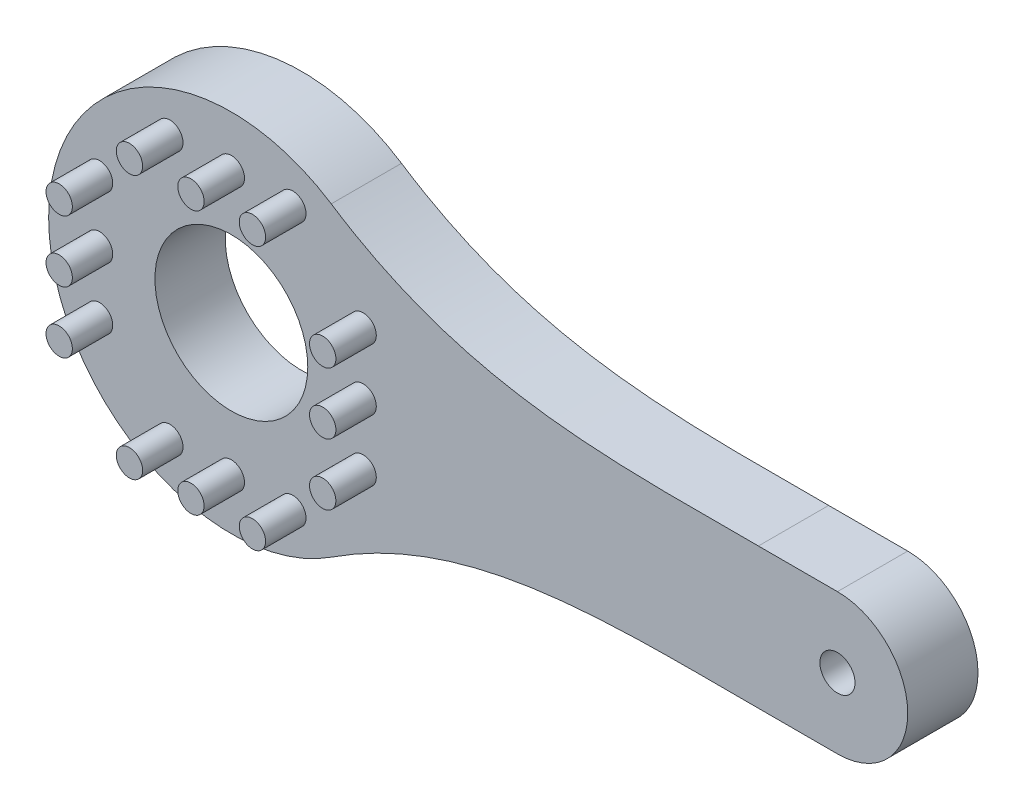
ISO-10303-21;
HEADER;
FILE_DESCRIPTION(('STEP AP214'),'2;1');
FILE_NAME('part.step','',(''),(''),'','','');
FILE_SCHEMA(('AUTOMOTIVE_DESIGN { 1 0 10303 214 1 1 1 1 }'));
ENDSEC;
DATA;
#1=APPLICATION_CONTEXT('core data for automotive mechanical design processes');
#2=APPLICATION_PROTOCOL_DEFINITION('international standard','automotive_design',2000,#1);
#3=PRODUCT_CONTEXT('',#1,'mechanical');
#4=PRODUCT('Part','Part','',(#3));
#5=PRODUCT_RELATED_PRODUCT_CATEGORY('part','',(#4));
#6=PRODUCT_DEFINITION_FORMATION('','',#4);
#7=PRODUCT_DEFINITION_CONTEXT('part definition',#1,'design');
#8=PRODUCT_DEFINITION('design','',#6,#7);
#9=PRODUCT_DEFINITION_SHAPE('','',#8);
#10=(LENGTH_UNIT() NAMED_UNIT(*) SI_UNIT(.MILLI.,.METRE.));
#11=(NAMED_UNIT(*) PLANE_ANGLE_UNIT() SI_UNIT($,.RADIAN.));
#12=(NAMED_UNIT(*) SI_UNIT($,.STERADIAN.) SOLID_ANGLE_UNIT());
#13=UNCERTAINTY_MEASURE_WITH_UNIT(LENGTH_MEASURE(1.E-05),#10,'distance_accuracy_value','');
#14=(GEOMETRIC_REPRESENTATION_CONTEXT(3) GLOBAL_UNCERTAINTY_ASSIGNED_CONTEXT((#13)) GLOBAL_UNIT_ASSIGNED_CONTEXT((#10,
#11,#12)) REPRESENTATION_CONTEXT('',''));
#15=CARTESIAN_POINT('',(0.,0.,0.));
#16=DIRECTION('',(0.,0.,1.));
#17=DIRECTION('',(1.,0.,0.));
#18=AXIS2_PLACEMENT_3D('',#15,#16,#17);
#19=CARTESIAN_POINT('',(17.4647591380404,4.46248690203293,4.));
#20=DIRECTION('',(0.,0.,-1.));
#21=DIRECTION('',(-1.,0.,0.));
#22=AXIS2_PLACEMENT_3D('',#19,#20,#21);
#23=PLANE('',#22);
#24=CARTESIAN_POINT('',(-7.5,3.5,4.));
#25=DIRECTION('',(0.,0.,-1.));
#26=DIRECTION('',(-1.,0.,0.));
#27=AXIS2_PLACEMENT_3D('',#24,#25,#26);
#28=CIRCLE('',#27,0.75);
#29=CARTESIAN_POINT('',(-8.25,3.5,4.));
#30=VERTEX_POINT('',#29);
#31=EDGE_CURVE('E11',#30,#30,#28,.F.);
#32=ORIENTED_EDGE('',*,*,#31,.F.);
#33=EDGE_LOOP('',(#32));
#34=FACE_BOUND('',#33,.T.);
#35=CARTESIAN_POINT('',(-7.5,0.,4.));
#36=DIRECTION('',(0.,0.,-1.));
#37=DIRECTION('',(-1.,0.,0.));
#38=AXIS2_PLACEMENT_3D('',#35,#36,#37);
#39=CIRCLE('',#38,0.749999999999998);
#40=CARTESIAN_POINT('',(-8.25,0.,4.));
#41=VERTEX_POINT('',#40);
#42=EDGE_CURVE('E48',#41,#41,#39,.F.);
#43=ORIENTED_EDGE('',*,*,#42,.F.);
#44=EDGE_LOOP('',(#43));
#45=FACE_BOUND('',#44,.T.);
#46=CARTESIAN_POINT('',(-7.5,-3.5,4.));
#47=DIRECTION('',(0.,0.,-1.));
#48=DIRECTION('',(-1.,0.,0.));
#49=AXIS2_PLACEMENT_3D('',#46,#47,#48);
#50=CIRCLE('',#49,0.75);
#51=CARTESIAN_POINT('',(-8.25,-3.5,4.));
#52=VERTEX_POINT('',#51);
#53=EDGE_CURVE('E182',#52,#52,#50,.F.);
#54=ORIENTED_EDGE('',*,*,#53,.F.);
#55=EDGE_LOOP('',(#54));
#56=FACE_BOUND('',#55,.T.);
#57=CARTESIAN_POINT('',(7.5,-3.5,4.));
#58=DIRECTION('',(0.,0.,-1.));
#59=DIRECTION('',(-1.,0.,0.));
#60=AXIS2_PLACEMENT_3D('',#57,#58,#59);
#61=CIRCLE('',#60,0.75);
#62=CARTESIAN_POINT('',(6.75,-3.5,4.));
#63=VERTEX_POINT('',#62);
#64=EDGE_CURVE('E179',#63,#63,#61,.F.);
#65=ORIENTED_EDGE('',*,*,#64,.F.);
#66=EDGE_LOOP('',(#65));
#67=FACE_BOUND('',#66,.T.);
#68=CARTESIAN_POINT('',(7.5,0.,4.));
#69=DIRECTION('',(0.,0.,-1.));
#70=DIRECTION('',(-1.,0.,0.));
#71=AXIS2_PLACEMENT_3D('',#68,#69,#70);
#72=CIRCLE('',#71,0.749999999999998);
#73=CARTESIAN_POINT('',(6.75,0.,4.));
#74=VERTEX_POINT('',#73);
#75=EDGE_CURVE('E176',#74,#74,#72,.F.);
#76=ORIENTED_EDGE('',*,*,#75,.F.);
#77=EDGE_LOOP('',(#76));
#78=FACE_BOUND('',#77,.T.);
#79=CARTESIAN_POINT('',(-3.5,-7.5,4.));
#80=DIRECTION('',(0.,0.,-1.));
#81=DIRECTION('',(-1.,0.,0.));
#82=AXIS2_PLACEMENT_3D('',#79,#80,#81);
#83=CIRCLE('',#82,0.749999999999999);
#84=CARTESIAN_POINT('',(-4.25,-7.5,4.));
#85=VERTEX_POINT('',#84);
#86=EDGE_CURVE('E173',#85,#85,#83,.F.);
#87=ORIENTED_EDGE('',*,*,#86,.F.);
#88=EDGE_LOOP('',(#87));
#89=FACE_BOUND('',#88,.T.);
#90=CARTESIAN_POINT('',(0.,-7.5,4.));
#91=DIRECTION('',(0.,0.,-1.));
#92=DIRECTION('',(-1.,0.,0.));
#93=AXIS2_PLACEMENT_3D('',#90,#91,#92);
#94=CIRCLE('',#93,0.75);
#95=CARTESIAN_POINT('',(-0.750000000000001,-7.5,4.));
#96=VERTEX_POINT('',#95);
#97=EDGE_CURVE('E170',#96,#96,#94,.F.);
#98=ORIENTED_EDGE('',*,*,#97,.F.);
#99=EDGE_LOOP('',(#98));
#100=FACE_BOUND('',#99,.T.);
#101=CARTESIAN_POINT('',(3.5,-7.5,4.));
#102=DIRECTION('',(0.,0.,-1.));
#103=DIRECTION('',(-1.,0.,0.));
#104=AXIS2_PLACEMENT_3D('',#101,#102,#103);
#105=CIRCLE('',#104,0.749999999999999);
#106=CARTESIAN_POINT('',(2.75,-7.5,4.));
#107=VERTEX_POINT('',#106);
#108=EDGE_CURVE('E167',#107,#107,#105,.F.);
#109=ORIENTED_EDGE('',*,*,#108,.F.);
#110=EDGE_LOOP('',(#109));
#111=FACE_BOUND('',#110,.T.);
#112=CARTESIAN_POINT('',(-3.5,7.5,4.));
#113=DIRECTION('',(0.,0.,-1.));
#114=DIRECTION('',(-1.,0.,0.));
#115=AXIS2_PLACEMENT_3D('',#112,#113,#114);
#116=CIRCLE('',#115,0.749999999999999);
#117=CARTESIAN_POINT('',(-4.25,7.5,4.));
#118=VERTEX_POINT('',#117);
#119=EDGE_CURVE('E164',#118,#118,#116,.F.);
#120=ORIENTED_EDGE('',*,*,#119,.F.);
#121=EDGE_LOOP('',(#120));
#122=FACE_BOUND('',#121,.T.);
#123=CARTESIAN_POINT('',(7.5,3.5,4.));
#124=DIRECTION('',(0.,0.,-1.));
#125=DIRECTION('',(-1.,0.,0.));
#126=AXIS2_PLACEMENT_3D('',#123,#124,#125);
#127=CIRCLE('',#126,0.75);
#128=CARTESIAN_POINT('',(6.75,3.5,4.));
#129=VERTEX_POINT('',#128);
#130=EDGE_CURVE('E161',#129,#129,#127,.F.);
#131=ORIENTED_EDGE('',*,*,#130,.F.);
#132=EDGE_LOOP('',(#131));
#133=FACE_BOUND('',#132,.T.);
#134=CARTESIAN_POINT('',(3.5,7.5,4.));
#135=DIRECTION('',(0.,0.,-1.));
#136=DIRECTION('',(-1.,0.,0.));
#137=AXIS2_PLACEMENT_3D('',#134,#135,#136);
#138=CIRCLE('',#137,0.749999999999999);
#139=CARTESIAN_POINT('',(2.75,7.5,4.));
#140=VERTEX_POINT('',#139);
#141=EDGE_CURVE('E158',#140,#140,#138,.F.);
#142=ORIENTED_EDGE('',*,*,#141,.F.);
#143=EDGE_LOOP('',(#142));
#144=FACE_BOUND('',#143,.T.);
#145=CARTESIAN_POINT('',(0.,7.5,4.));
#146=DIRECTION('',(0.,0.,-1.));
#147=DIRECTION('',(-1.,0.,0.));
#148=AXIS2_PLACEMENT_3D('',#145,#146,#147);
#149=CIRCLE('',#148,0.75);
#150=CARTESIAN_POINT('',(-0.750000000000001,7.5,4.));
#151=VERTEX_POINT('',#150);
#152=EDGE_CURVE('E155',#151,#151,#149,.F.);
#153=ORIENTED_EDGE('',*,*,#152,.F.);
#154=EDGE_LOOP('',(#153));
#155=FACE_BOUND('',#154,.T.);
#156=CARTESIAN_POINT('',(30.,4.,4.));
#157=CARTESIAN_POINT('',(21.2668653818899,4.,4.));
#158=CARTESIAN_POINT('',(13.4104279790372,3.66400440550072,4.));
#159=CARTESIAN_POINT('',(5.68619302154209,8.70788199976125,4.));
#160=B_SPLINE_CURVE_WITH_KNOTS('',3,(#156,#157,#158,#159),.UNSPECIFIED.,.F.,.F.,(4,4),(0.,1.),.UNSPECIFIED.);
#161=CARTESIAN_POINT('',(30.,4.,4.));
#162=VERTEX_POINT('',#161);
#163=CARTESIAN_POINT('',(5.68619302154209,8.70788199976125,4.));
#164=VERTEX_POINT('',#163);
#165=EDGE_CURVE('E146',#162,#164,#160,.T.);
#166=ORIENTED_EDGE('',*,*,#165,.T.);
#167=CARTESIAN_POINT('',(0.,0.,4.));
#168=DIRECTION('',(0.,0.,1.));
#169=DIRECTION('',(1.,0.,0.));
#170=AXIS2_PLACEMENT_3D('',#167,#168,#169);
#171=CIRCLE('',#170,10.4);
#172=CARTESIAN_POINT('',(5.68619302154209,-8.70788199976125,4.));
#173=VERTEX_POINT('',#172);
#174=EDGE_CURVE('E94',#164,#173,#171,.T.);
#175=ORIENTED_EDGE('',*,*,#174,.T.);
#176=CARTESIAN_POINT('',(5.68619302154209,-8.70788199976125,4.));
#177=CARTESIAN_POINT('',(13.4104279790372,-3.66400440550072,4.));
#178=CARTESIAN_POINT('',(21.2668653818899,-4.,4.));
#179=CARTESIAN_POINT('',(30.,-4.,4.));
#180=B_SPLINE_CURVE_WITH_KNOTS('',3,(#176,#177,#178,#179),.UNSPECIFIED.,.F.,.F.,(4,4),(0.,1.),.UNSPECIFIED.);
#181=CARTESIAN_POINT('',(30.,-4.,4.));
#182=VERTEX_POINT('',#181);
#183=EDGE_CURVE('E107',#173,#182,#180,.T.);
#184=ORIENTED_EDGE('',*,*,#183,.T.);
#185=DIRECTION('',(1.,0.,0.));
#186=VECTOR('',#185,1.);
#187=CARTESIAN_POINT('',(30.,-4.,4.));
#188=LINE('',#187,#186);
#189=CARTESIAN_POINT('',(34.5,-4.,4.));
#190=VERTEX_POINT('',#189);
#191=EDGE_CURVE('E101',#182,#190,#188,.T.);
#192=ORIENTED_EDGE('',*,*,#191,.T.);
#193=CARTESIAN_POINT('',(34.5,0.,4.));
#194=DIRECTION('',(0.,0.,1.));
#195=DIRECTION('',(-1.,0.,0.));
#196=AXIS2_PLACEMENT_3D('',#193,#194,#195);
#197=CIRCLE('',#196,4.);
#198=CARTESIAN_POINT('',(34.5,4.,4.));
#199=VERTEX_POINT('',#198);
#200=EDGE_CURVE('E105',#190,#199,#197,.T.);
#201=ORIENTED_EDGE('',*,*,#200,.T.);
#202=DIRECTION('',(-1.,0.,0.));
#203=VECTOR('',#202,1.);
#204=CARTESIAN_POINT('',(30.,4.,4.));
#205=LINE('',#204,#203);
#206=EDGE_CURVE('E56',#199,#162,#205,.T.);
#207=ORIENTED_EDGE('',*,*,#206,.T.);
#208=EDGE_LOOP('',(#166,#175,#184,#192,#201,#207));
#209=FACE_BOUND('',#208,.T.);
#210=CARTESIAN_POINT('',(34.5,0.,4.));
#211=DIRECTION('',(0.,0.,1.));
#212=DIRECTION('',(1.,0.,0.));
#213=AXIS2_PLACEMENT_3D('',#210,#211,#212);
#214=CIRCLE('',#213,0.999999999999998);
#215=CARTESIAN_POINT('',(35.5,0.,4.));
#216=VERTEX_POINT('',#215);
#217=EDGE_CURVE('E131',#216,#216,#214,.T.);
#218=ORIENTED_EDGE('',*,*,#217,.F.);
#219=EDGE_LOOP('',(#218));
#220=FACE_BOUND('',#219,.T.);
#221=CARTESIAN_POINT('',(0.,0.,4.));
#222=DIRECTION('',(0.,0.,1.));
#223=DIRECTION('',(1.,0.,0.));
#224=AXIS2_PLACEMENT_3D('',#221,#222,#223);
#225=CIRCLE('',#224,4.35);
#226=CARTESIAN_POINT('',(4.35,0.,4.));
#227=VERTEX_POINT('',#226);
#228=EDGE_CURVE('E267',#227,#227,#225,.T.);
#229=ORIENTED_EDGE('',*,*,#228,.F.);
#230=EDGE_LOOP('',(#229));
#231=FACE_BOUND('',#230,.T.);
#232=ADVANCED_FACE('F38',(#34,#45,#56,#67,#78,#89,#100,#111,#122,#133,#144,#155,#209,#220,#231),
#23,.F.);
#233=CARTESIAN_POINT('',(17.4647591380404,4.46248690203293,0.));
#234=DIRECTION('',(0.,0.,-1.));
#235=DIRECTION('',(-1.,0.,0.));
#236=AXIS2_PLACEMENT_3D('',#233,#234,#235);
#237=PLANE('',#236);
#238=CARTESIAN_POINT('',(34.5,0.,0.));
#239=DIRECTION('',(0.,0.,1.));
#240=DIRECTION('',(1.,0.,0.));
#241=AXIS2_PLACEMENT_3D('',#238,#239,#240);
#242=CIRCLE('',#241,0.999999999999998);
#243=CARTESIAN_POINT('',(35.5,0.,0.));
#244=VERTEX_POINT('',#243);
#245=EDGE_CURVE('E261',#244,#244,#242,.T.);
#246=ORIENTED_EDGE('',*,*,#245,.T.);
#247=EDGE_LOOP('',(#246));
#248=FACE_BOUND('',#247,.T.);
#249=CARTESIAN_POINT('',(30.,4.,0.));
#250=CARTESIAN_POINT('',(21.2668653818899,4.,0.));
#251=CARTESIAN_POINT('',(13.4104279790372,3.66400440550072,0.));
#252=CARTESIAN_POINT('',(5.68619302154209,8.70788199976125,0.));
#253=B_SPLINE_CURVE_WITH_KNOTS('',3,(#249,#250,#251,#252),.UNSPECIFIED.,.F.,.F.,(4,4),(0.,1.),.UNSPECIFIED.);
#254=CARTESIAN_POINT('',(30.,4.,0.));
#255=VERTEX_POINT('',#254);
#256=CARTESIAN_POINT('',(5.68619302154209,8.70788199976125,0.));
#257=VERTEX_POINT('',#256);
#258=EDGE_CURVE('E125',#255,#257,#253,.T.);
#259=ORIENTED_EDGE('',*,*,#258,.F.);
#260=DIRECTION('',(-1.,0.,0.));
#261=VECTOR('',#260,1.);
#262=CARTESIAN_POINT('',(30.,4.,0.));
#263=LINE('',#262,#261);
#264=CARTESIAN_POINT('',(34.5,4.,0.));
#265=VERTEX_POINT('',#264);
#266=EDGE_CURVE('E85',#265,#255,#263,.T.);
#267=ORIENTED_EDGE('',*,*,#266,.F.);
#268=CARTESIAN_POINT('',(34.5,0.,0.));
#269=DIRECTION('',(0.,0.,1.));
#270=DIRECTION('',(-1.,0.,0.));
#271=AXIS2_PLACEMENT_3D('',#268,#269,#270);
#272=CIRCLE('',#271,4.);
#273=CARTESIAN_POINT('',(34.5,-4.,0.));
#274=VERTEX_POINT('',#273);
#275=EDGE_CURVE('E79',#274,#265,#272,.T.);
#276=ORIENTED_EDGE('',*,*,#275,.F.);
#277=DIRECTION('',(1.,0.,0.));
#278=VECTOR('',#277,1.);
#279=CARTESIAN_POINT('',(30.,-4.,0.));
#280=LINE('',#279,#278);
#281=CARTESIAN_POINT('',(30.,-4.,0.));
#282=VERTEX_POINT('',#281);
#283=EDGE_CURVE('E115',#282,#274,#280,.T.);
#284=ORIENTED_EDGE('',*,*,#283,.F.);
#285=CARTESIAN_POINT('',(5.68619302154209,-8.70788199976125,0.));
#286=CARTESIAN_POINT('',(13.4104279790372,-3.66400440550072,0.));
#287=CARTESIAN_POINT('',(21.2668653818899,-4.,0.));
#288=CARTESIAN_POINT('',(30.,-4.,0.));
#289=B_SPLINE_CURVE_WITH_KNOTS('',3,(#285,#286,#287,#288),.UNSPECIFIED.,.F.,.F.,(4,4),(0.,1.),.UNSPECIFIED.);
#290=CARTESIAN_POINT('',(5.68619302154209,-8.70788199976125,0.));
#291=VERTEX_POINT('',#290);
#292=EDGE_CURVE('E136',#291,#282,#289,.T.);
#293=ORIENTED_EDGE('',*,*,#292,.F.);
#294=CARTESIAN_POINT('',(0.,0.,0.));
#295=DIRECTION('',(0.,0.,1.));
#296=DIRECTION('',(1.,0.,0.));
#297=AXIS2_PLACEMENT_3D('',#294,#295,#296);
#298=CIRCLE('',#297,10.4);
#299=EDGE_CURVE('E130',#257,#291,#298,.T.);
#300=ORIENTED_EDGE('',*,*,#299,.F.);
#301=EDGE_LOOP('',(#259,#267,#276,#284,#293,#300));
#302=FACE_BOUND('',#301,.T.);
#303=CARTESIAN_POINT('',(0.,0.,0.));
#304=DIRECTION('',(0.,0.,1.));
#305=DIRECTION('',(1.,0.,0.));
#306=AXIS2_PLACEMENT_3D('',#303,#304,#305);
#307=CIRCLE('',#306,4.35);
#308=CARTESIAN_POINT('',(4.35,0.,0.));
#309=VERTEX_POINT('',#308);
#310=EDGE_CURVE('E270',#309,#309,#307,.T.);
#311=ORIENTED_EDGE('',*,*,#310,.T.);
#312=EDGE_LOOP('',(#311));
#313=FACE_BOUND('',#312,.T.);
#314=ADVANCED_FACE('F191',(#248,#302,#313),#237,.T.);
#315=DIRECTION('',(0.,0.,-1.));
#316=VECTOR('',#315,1.);
#317=SURFACE_OF_LINEAR_EXTRUSION('',#160,#316);
#318=ORIENTED_EDGE('',*,*,#258,.T.);
#319=DIRECTION('',(0.,0.,-1.));
#320=VECTOR('',#319,1.);
#321=CARTESIAN_POINT('',(5.68619302154209,8.70788199976125,4.));
#322=LINE('',#321,#320);
#323=EDGE_CURVE('E153',#164,#257,#322,.T.);
#324=ORIENTED_EDGE('',*,*,#323,.F.);
#325=ORIENTED_EDGE('',*,*,#165,.F.);
#326=DIRECTION('',(0.,0.,-1.));
#327=VECTOR('',#326,1.);
#328=CARTESIAN_POINT('',(30.,4.,4.));
#329=LINE('',#328,#327);
#330=EDGE_CURVE('E121',#162,#255,#329,.T.);
#331=ORIENTED_EDGE('',*,*,#330,.T.);
#332=EDGE_LOOP('',(#318,#324,#325,#331));
#333=FACE_BOUND('',#332,.T.);
#334=ADVANCED_FACE('F40',(#333),#317,.F.);
#335=CARTESIAN_POINT('',(0.,0.,4.));
#336=DIRECTION('',(0.,0.,-1.));
#337=DIRECTION('',(-1.,0.,0.));
#338=AXIS2_PLACEMENT_3D('',#335,#336,#337);
#339=CYLINDRICAL_SURFACE('',#338,10.4);
#340=ORIENTED_EDGE('',*,*,#299,.T.);
#341=DIRECTION('',(0.,0.,-1.));
#342=VECTOR('',#341,1.);
#343=CARTESIAN_POINT('',(5.68619302154209,-8.70788199976125,4.));
#344=LINE('',#343,#342);
#345=EDGE_CURVE('E150',#173,#291,#344,.T.);
#346=ORIENTED_EDGE('',*,*,#345,.F.);
#347=ORIENTED_EDGE('',*,*,#174,.F.);
#348=ORIENTED_EDGE('',*,*,#323,.T.);
#349=EDGE_LOOP('',(#340,#346,#347,#348));
#350=FACE_BOUND('',#349,.T.);
#351=ADVANCED_FACE('F248',(#350),#339,.T.);
#352=DIRECTION('',(0.,0.,-1.));
#353=VECTOR('',#352,1.);
#354=SURFACE_OF_LINEAR_EXTRUSION('',#180,#353);
#355=ORIENTED_EDGE('',*,*,#292,.T.);
#356=DIRECTION('',(0.,0.,-1.));
#357=VECTOR('',#356,1.);
#358=CARTESIAN_POINT('',(30.,-4.,4.));
#359=LINE('',#358,#357);
#360=EDGE_CURVE('E116',#182,#282,#359,.T.);
#361=ORIENTED_EDGE('',*,*,#360,.F.);
#362=ORIENTED_EDGE('',*,*,#183,.F.);
#363=ORIENTED_EDGE('',*,*,#345,.T.);
#364=EDGE_LOOP('',(#355,#361,#362,#363));
#365=FACE_BOUND('',#364,.T.);
#366=ADVANCED_FACE('F246',(#365),#354,.F.);
#367=CARTESIAN_POINT('',(30.,-4.,4.));
#368=DIRECTION('',(0.,1.,0.));
#369=DIRECTION('',(0.,0.,1.));
#370=AXIS2_PLACEMENT_3D('',#367,#368,#369);
#371=PLANE('',#370);
#372=ORIENTED_EDGE('',*,*,#283,.T.);
#373=DIRECTION('',(0.,0.,-1.));
#374=VECTOR('',#373,1.);
#375=CARTESIAN_POINT('',(34.5,-4.,4.));
#376=LINE('',#375,#374);
#377=EDGE_CURVE('E112',#190,#274,#376,.T.);
#378=ORIENTED_EDGE('',*,*,#377,.F.);
#379=ORIENTED_EDGE('',*,*,#191,.F.);
#380=ORIENTED_EDGE('',*,*,#360,.T.);
#381=EDGE_LOOP('',(#372,#378,#379,#380));
#382=FACE_BOUND('',#381,.T.);
#383=ADVANCED_FACE('F113',(#382),#371,.F.);
#384=CARTESIAN_POINT('',(34.5,0.,4.));
#385=DIRECTION('',(0.,0.,-1.));
#386=DIRECTION('',(-1.,0.,0.));
#387=AXIS2_PLACEMENT_3D('',#384,#385,#386);
#388=CYLINDRICAL_SURFACE('',#387,4.);
#389=ORIENTED_EDGE('',*,*,#275,.T.);
#390=DIRECTION('',(0.,0.,-1.));
#391=VECTOR('',#390,1.);
#392=CARTESIAN_POINT('',(34.5,4.,4.));
#393=LINE('',#392,#391);
#394=EDGE_CURVE('E117',#199,#265,#393,.T.);
#395=ORIENTED_EDGE('',*,*,#394,.F.);
#396=ORIENTED_EDGE('',*,*,#200,.F.);
#397=ORIENTED_EDGE('',*,*,#377,.T.);
#398=EDGE_LOOP('',(#389,#395,#396,#397));
#399=FACE_BOUND('',#398,.T.);
#400=ADVANCED_FACE('F119',(#399),#388,.T.);
#401=CARTESIAN_POINT('',(30.,4.,4.));
#402=DIRECTION('',(0.,-1.,0.));
#403=DIRECTION('',(0.,0.,-1.));
#404=AXIS2_PLACEMENT_3D('',#401,#402,#403);
#405=PLANE('',#404);
#406=ORIENTED_EDGE('',*,*,#266,.T.);
#407=ORIENTED_EDGE('',*,*,#330,.F.);
#408=ORIENTED_EDGE('',*,*,#206,.F.);
#409=ORIENTED_EDGE('',*,*,#394,.T.);
#410=EDGE_LOOP('',(#406,#407,#408,#409));
#411=FACE_BOUND('',#410,.T.);
#412=ADVANCED_FACE('F234',(#411),#405,.F.);
#413=CARTESIAN_POINT('',(34.5,0.,4.));
#414=DIRECTION('',(0.,0.,-1.));
#415=DIRECTION('',(-1.,0.,0.));
#416=AXIS2_PLACEMENT_3D('',#413,#414,#415);
#417=CYLINDRICAL_SURFACE('',#416,0.999999999999998);
#418=ORIENTED_EDGE('',*,*,#217,.T.);
#419=EDGE_LOOP('',(#418));
#420=FACE_BOUND('',#419,.T.);
#421=ORIENTED_EDGE('',*,*,#245,.F.);
#422=EDGE_LOOP('',(#421));
#423=FACE_BOUND('',#422,.T.);
#424=ADVANCED_FACE('F227',(#420,#423),#417,.F.);
#425=CARTESIAN_POINT('',(0.,0.,4.));
#426=DIRECTION('',(0.,0.,-1.));
#427=DIRECTION('',(-1.,0.,0.));
#428=AXIS2_PLACEMENT_3D('',#425,#426,#427);
#429=CYLINDRICAL_SURFACE('',#428,4.35);
#430=ORIENTED_EDGE('',*,*,#228,.T.);
#431=EDGE_LOOP('',(#430));
#432=FACE_BOUND('',#431,.T.);
#433=ORIENTED_EDGE('',*,*,#310,.F.);
#434=EDGE_LOOP('',(#433));
#435=FACE_BOUND('',#434,.T.);
#436=ADVANCED_FACE('F217',(#432,#435),#429,.F.);
#437=CARTESIAN_POINT('',(0.,7.5,6.3));
#438=DIRECTION('',(0.,0.,-1.));
#439=DIRECTION('',(-1.,0.,0.));
#440=AXIS2_PLACEMENT_3D('',#437,#438,#439);
#441=CYLINDRICAL_SURFACE('',#440,0.75);
#442=CARTESIAN_POINT('',(0.,7.5,6.3));
#443=DIRECTION('',(0.,0.,1.));
#444=DIRECTION('',(1.,0.,0.));
#445=AXIS2_PLACEMENT_3D('',#442,#443,#444);
#446=CIRCLE('',#445,0.75);
#447=CARTESIAN_POINT('',(0.749999999999999,7.5,6.3));
#448=VERTEX_POINT('',#447);
#449=EDGE_CURVE('E273',#448,#448,#446,.T.);
#450=ORIENTED_EDGE('',*,*,#449,.F.);
#451=EDGE_LOOP('',(#450));
#452=FACE_BOUND('',#451,.T.);
#453=ORIENTED_EDGE('',*,*,#152,.T.);
#454=EDGE_LOOP('',(#453));
#455=FACE_BOUND('',#454,.T.);
#456=ADVANCED_FACE('F214',(#452,#455),#441,.T.);
#457=CARTESIAN_POINT('',(0.,7.5,6.3));
#458=DIRECTION('',(0.,0.,1.));
#459=DIRECTION('',(1.,0.,0.));
#460=AXIS2_PLACEMENT_3D('',#457,#458,#459);
#461=PLANE('',#460);
#462=ORIENTED_EDGE('',*,*,#449,.T.);
#463=EDGE_LOOP('',(#462));
#464=FACE_BOUND('',#463,.T.);
#465=ADVANCED_FACE('F216',(#464),#461,.T.);
#466=CARTESIAN_POINT('',(3.5,7.5,6.3));
#467=DIRECTION('',(0.,0.,-1.));
#468=DIRECTION('',(-1.,0.,0.));
#469=AXIS2_PLACEMENT_3D('',#466,#467,#468);
#470=CYLINDRICAL_SURFACE('',#469,0.749999999999999);
#471=CARTESIAN_POINT('',(3.5,7.5,6.3));
#472=DIRECTION('',(0.,0.,1.));
#473=DIRECTION('',(1.,0.,0.));
#474=AXIS2_PLACEMENT_3D('',#471,#472,#473);
#475=CIRCLE('',#474,0.749999999999999);
#476=CARTESIAN_POINT('',(4.25,7.5,6.3));
#477=VERTEX_POINT('',#476);
#478=EDGE_CURVE('E278',#477,#477,#475,.T.);
#479=ORIENTED_EDGE('',*,*,#478,.F.);
#480=EDGE_LOOP('',(#479));
#481=FACE_BOUND('',#480,.T.);
#482=ORIENTED_EDGE('',*,*,#141,.T.);
#483=EDGE_LOOP('',(#482));
#484=FACE_BOUND('',#483,.T.);
#485=ADVANCED_FACE('F224',(#481,#484),#470,.T.);
#486=CARTESIAN_POINT('',(3.5,7.5,6.3));
#487=DIRECTION('',(0.,0.,1.));
#488=DIRECTION('',(1.,0.,0.));
#489=AXIS2_PLACEMENT_3D('',#486,#487,#488);
#490=PLANE('',#489);
#491=ORIENTED_EDGE('',*,*,#478,.T.);
#492=EDGE_LOOP('',(#491));
#493=FACE_BOUND('',#492,.T.);
#494=ADVANCED_FACE('F394',(#493),#490,.T.);
#495=CARTESIAN_POINT('',(7.5,3.5,6.3));
#496=DIRECTION('',(0.,0.,-1.));
#497=DIRECTION('',(-1.,0.,0.));
#498=AXIS2_PLACEMENT_3D('',#495,#496,#497);
#499=CYLINDRICAL_SURFACE('',#498,0.75);
#500=CARTESIAN_POINT('',(7.5,3.5,6.3));
#501=DIRECTION('',(0.,0.,1.));
#502=DIRECTION('',(1.,0.,0.));
#503=AXIS2_PLACEMENT_3D('',#500,#501,#502);
#504=CIRCLE('',#503,0.75);
#505=CARTESIAN_POINT('',(8.25,3.5,6.3));
#506=VERTEX_POINT('',#505);
#507=EDGE_CURVE('E281',#506,#506,#504,.T.);
#508=ORIENTED_EDGE('',*,*,#507,.F.);
#509=EDGE_LOOP('',(#508));
#510=FACE_BOUND('',#509,.T.);
#511=ORIENTED_EDGE('',*,*,#130,.T.);
#512=EDGE_LOOP('',(#511));
#513=FACE_BOUND('',#512,.T.);
#514=ADVANCED_FACE('F390',(#510,#513),#499,.T.);
#515=CARTESIAN_POINT('',(7.5,3.5,6.3));
#516=DIRECTION('',(0.,0.,1.));
#517=DIRECTION('',(1.,0.,0.));
#518=AXIS2_PLACEMENT_3D('',#515,#516,#517);
#519=PLANE('',#518);
#520=ORIENTED_EDGE('',*,*,#507,.T.);
#521=EDGE_LOOP('',(#520));
#522=FACE_BOUND('',#521,.T.);
#523=ADVANCED_FACE('F386',(#522),#519,.T.);
#524=CARTESIAN_POINT('',(-3.5,7.5,6.3));
#525=DIRECTION('',(0.,0.,-1.));
#526=DIRECTION('',(-1.,0.,0.));
#527=AXIS2_PLACEMENT_3D('',#524,#525,#526);
#528=CYLINDRICAL_SURFACE('',#527,0.749999999999999);
#529=CARTESIAN_POINT('',(-3.5,7.5,6.3));
#530=DIRECTION('',(0.,0.,1.));
#531=DIRECTION('',(-1.,0.,0.));
#532=AXIS2_PLACEMENT_3D('',#529,#530,#531);
#533=CIRCLE('',#532,0.749999999999999);
#534=CARTESIAN_POINT('',(-4.25,7.5,6.3));
#535=VERTEX_POINT('',#534);
#536=EDGE_CURVE('E284',#535,#535,#533,.T.);
#537=ORIENTED_EDGE('',*,*,#536,.F.);
#538=EDGE_LOOP('',(#537));
#539=FACE_BOUND('',#538,.T.);
#540=ORIENTED_EDGE('',*,*,#119,.T.);
#541=EDGE_LOOP('',(#540));
#542=FACE_BOUND('',#541,.T.);
#543=ADVANCED_FACE('F382',(#539,#542),#528,.T.);
#544=CARTESIAN_POINT('',(-3.5,7.5,6.3));
#545=DIRECTION('',(0.,0.,-1.));
#546=DIRECTION('',(-1.,0.,0.));
#547=AXIS2_PLACEMENT_3D('',#544,#545,#546);
#548=PLANE('',#547);
#549=ORIENTED_EDGE('',*,*,#536,.T.);
#550=EDGE_LOOP('',(#549));
#551=FACE_BOUND('',#550,.T.);
#552=ADVANCED_FACE('F378',(#551),#548,.F.);
#553=CARTESIAN_POINT('',(3.5,-7.5,6.3));
#554=DIRECTION('',(0.,0.,-1.));
#555=DIRECTION('',(-1.,0.,0.));
#556=AXIS2_PLACEMENT_3D('',#553,#554,#555);
#557=CYLINDRICAL_SURFACE('',#556,0.749999999999999);
#558=CARTESIAN_POINT('',(3.5,-7.5,6.3));
#559=DIRECTION('',(0.,0.,1.));
#560=DIRECTION('',(-1.,0.,0.));
#561=AXIS2_PLACEMENT_3D('',#558,#559,#560);
#562=CIRCLE('',#561,0.749999999999999);
#563=CARTESIAN_POINT('',(2.75,-7.5,6.3));
#564=VERTEX_POINT('',#563);
#565=EDGE_CURVE('E287',#564,#564,#562,.T.);
#566=ORIENTED_EDGE('',*,*,#565,.F.);
#567=EDGE_LOOP('',(#566));
#568=FACE_BOUND('',#567,.T.);
#569=ORIENTED_EDGE('',*,*,#108,.T.);
#570=EDGE_LOOP('',(#569));
#571=FACE_BOUND('',#570,.T.);
#572=ADVANCED_FACE('F374',(#568,#571),#557,.T.);
#573=CARTESIAN_POINT('',(3.5,-7.5,6.3));
#574=DIRECTION('',(0.,0.,-1.));
#575=DIRECTION('',(-1.,0.,0.));
#576=AXIS2_PLACEMENT_3D('',#573,#574,#575);
#577=PLANE('',#576);
#578=ORIENTED_EDGE('',*,*,#565,.T.);
#579=EDGE_LOOP('',(#578));
#580=FACE_BOUND('',#579,.T.);
#581=ADVANCED_FACE('F370',(#580),#577,.F.);
#582=CARTESIAN_POINT('',(0.,-7.5,6.3));
#583=DIRECTION('',(0.,0.,-1.));
#584=DIRECTION('',(-1.,0.,0.));
#585=AXIS2_PLACEMENT_3D('',#582,#583,#584);
#586=CYLINDRICAL_SURFACE('',#585,0.75);
#587=CARTESIAN_POINT('',(0.,-7.5,6.3));
#588=DIRECTION('',(0.,0.,1.));
#589=DIRECTION('',(-1.,0.,0.));
#590=AXIS2_PLACEMENT_3D('',#587,#588,#589);
#591=CIRCLE('',#590,0.75);
#592=CARTESIAN_POINT('',(-0.750000000000001,-7.5,6.3));
#593=VERTEX_POINT('',#592);
#594=EDGE_CURVE('E290',#593,#593,#591,.T.);
#595=ORIENTED_EDGE('',*,*,#594,.F.);
#596=EDGE_LOOP('',(#595));
#597=FACE_BOUND('',#596,.T.);
#598=ORIENTED_EDGE('',*,*,#97,.T.);
#599=EDGE_LOOP('',(#598));
#600=FACE_BOUND('',#599,.T.);
#601=ADVANCED_FACE('F366',(#597,#600),#586,.T.);
#602=CARTESIAN_POINT('',(0.,-7.5,6.3));
#603=DIRECTION('',(0.,0.,-1.));
#604=DIRECTION('',(-1.,0.,0.));
#605=AXIS2_PLACEMENT_3D('',#602,#603,#604);
#606=PLANE('',#605);
#607=ORIENTED_EDGE('',*,*,#594,.T.);
#608=EDGE_LOOP('',(#607));
#609=FACE_BOUND('',#608,.T.);
#610=ADVANCED_FACE('F362',(#609),#606,.F.);
#611=CARTESIAN_POINT('',(-3.5,-7.5,6.3));
#612=DIRECTION('',(0.,0.,-1.));
#613=DIRECTION('',(-1.,0.,0.));
#614=AXIS2_PLACEMENT_3D('',#611,#612,#613);
#615=CYLINDRICAL_SURFACE('',#614,0.749999999999999);
#616=CARTESIAN_POINT('',(-3.5,-7.5,6.3));
#617=DIRECTION('',(0.,0.,1.));
#618=DIRECTION('',(1.,0.,0.));
#619=AXIS2_PLACEMENT_3D('',#616,#617,#618);
#620=CIRCLE('',#619,0.749999999999999);
#621=CARTESIAN_POINT('',(-2.75,-7.5,6.3));
#622=VERTEX_POINT('',#621);
#623=EDGE_CURVE('E293',#622,#622,#620,.T.);
#624=ORIENTED_EDGE('',*,*,#623,.F.);
#625=EDGE_LOOP('',(#624));
#626=FACE_BOUND('',#625,.T.);
#627=ORIENTED_EDGE('',*,*,#86,.T.);
#628=EDGE_LOOP('',(#627));
#629=FACE_BOUND('',#628,.T.);
#630=ADVANCED_FACE('F358',(#626,#629),#615,.T.);
#631=CARTESIAN_POINT('',(-3.5,-7.5,6.3));
#632=DIRECTION('',(0.,0.,1.));
#633=DIRECTION('',(1.,0.,0.));
#634=AXIS2_PLACEMENT_3D('',#631,#632,#633);
#635=PLANE('',#634);
#636=ORIENTED_EDGE('',*,*,#623,.T.);
#637=EDGE_LOOP('',(#636));
#638=FACE_BOUND('',#637,.T.);
#639=ADVANCED_FACE('F354',(#638),#635,.T.);
#640=CARTESIAN_POINT('',(7.5,0.,6.3));
#641=DIRECTION('',(0.,0.,-1.));
#642=DIRECTION('',(-1.,0.,0.));
#643=AXIS2_PLACEMENT_3D('',#640,#641,#642);
#644=CYLINDRICAL_SURFACE('',#643,0.749999999999998);
#645=CARTESIAN_POINT('',(7.5,0.,6.3));
#646=DIRECTION('',(0.,0.,1.));
#647=DIRECTION('',(1.,0.,0.));
#648=AXIS2_PLACEMENT_3D('',#645,#646,#647);
#649=CIRCLE('',#648,0.749999999999998);
#650=CARTESIAN_POINT('',(8.25,0.,6.3));
#651=VERTEX_POINT('',#650);
#652=EDGE_CURVE('E296',#651,#651,#649,.T.);
#653=ORIENTED_EDGE('',*,*,#652,.F.);
#654=EDGE_LOOP('',(#653));
#655=FACE_BOUND('',#654,.T.);
#656=ORIENTED_EDGE('',*,*,#75,.T.);
#657=EDGE_LOOP('',(#656));
#658=FACE_BOUND('',#657,.T.);
#659=ADVANCED_FACE('F350',(#655,#658),#644,.T.);
#660=CARTESIAN_POINT('',(7.5,0.,6.3));
#661=DIRECTION('',(0.,0.,1.));
#662=DIRECTION('',(1.,0.,0.));
#663=AXIS2_PLACEMENT_3D('',#660,#661,#662);
#664=PLANE('',#663);
#665=ORIENTED_EDGE('',*,*,#652,.T.);
#666=EDGE_LOOP('',(#665));
#667=FACE_BOUND('',#666,.T.);
#668=ADVANCED_FACE('F346',(#667),#664,.T.);
#669=CARTESIAN_POINT('',(7.5,-3.5,6.3));
#670=DIRECTION('',(0.,0.,-1.));
#671=DIRECTION('',(-1.,0.,0.));
#672=AXIS2_PLACEMENT_3D('',#669,#670,#671);
#673=CYLINDRICAL_SURFACE('',#672,0.75);
#674=CARTESIAN_POINT('',(7.5,-3.5,6.3));
#675=DIRECTION('',(0.,0.,1.));
#676=DIRECTION('',(-1.,0.,0.));
#677=AXIS2_PLACEMENT_3D('',#674,#675,#676);
#678=CIRCLE('',#677,0.75);
#679=CARTESIAN_POINT('',(6.75,-3.5,6.3));
#680=VERTEX_POINT('',#679);
#681=EDGE_CURVE('E299',#680,#680,#678,.T.);
#682=ORIENTED_EDGE('',*,*,#681,.F.);
#683=EDGE_LOOP('',(#682));
#684=FACE_BOUND('',#683,.T.);
#685=ORIENTED_EDGE('',*,*,#64,.T.);
#686=EDGE_LOOP('',(#685));
#687=FACE_BOUND('',#686,.T.);
#688=ADVANCED_FACE('F342',(#684,#687),#673,.T.);
#689=CARTESIAN_POINT('',(7.5,-3.5,6.3));
#690=DIRECTION('',(0.,0.,-1.));
#691=DIRECTION('',(-1.,0.,0.));
#692=AXIS2_PLACEMENT_3D('',#689,#690,#691);
#693=PLANE('',#692);
#694=ORIENTED_EDGE('',*,*,#681,.T.);
#695=EDGE_LOOP('',(#694));
#696=FACE_BOUND('',#695,.T.);
#697=ADVANCED_FACE('F338',(#696),#693,.F.);
#698=CARTESIAN_POINT('',(-7.5,-3.5,6.3));
#699=DIRECTION('',(0.,0.,-1.));
#700=DIRECTION('',(-1.,0.,0.));
#701=AXIS2_PLACEMENT_3D('',#698,#699,#700);
#702=CYLINDRICAL_SURFACE('',#701,0.75);
#703=CARTESIAN_POINT('',(-7.5,-3.5,6.3));
#704=DIRECTION('',(0.,0.,1.));
#705=DIRECTION('',(1.,0.,0.));
#706=AXIS2_PLACEMENT_3D('',#703,#704,#705);
#707=CIRCLE('',#706,0.75);
#708=CARTESIAN_POINT('',(-6.75,-3.5,6.3));
#709=VERTEX_POINT('',#708);
#710=EDGE_CURVE('E302',#709,#709,#707,.T.);
#711=ORIENTED_EDGE('',*,*,#710,.F.);
#712=EDGE_LOOP('',(#711));
#713=FACE_BOUND('',#712,.T.);
#714=ORIENTED_EDGE('',*,*,#53,.T.);
#715=EDGE_LOOP('',(#714));
#716=FACE_BOUND('',#715,.T.);
#717=ADVANCED_FACE('F334',(#713,#716),#702,.T.);
#718=CARTESIAN_POINT('',(-7.5,-3.5,6.3));
#719=DIRECTION('',(0.,0.,1.));
#720=DIRECTION('',(1.,0.,0.));
#721=AXIS2_PLACEMENT_3D('',#718,#719,#720);
#722=PLANE('',#721);
#723=ORIENTED_EDGE('',*,*,#710,.T.);
#724=EDGE_LOOP('',(#723));
#725=FACE_BOUND('',#724,.T.);
#726=ADVANCED_FACE('F330',(#725),#722,.T.);
#727=CARTESIAN_POINT('',(-7.5,0.,6.3));
#728=DIRECTION('',(0.,0.,-1.));
#729=DIRECTION('',(-1.,0.,0.));
#730=AXIS2_PLACEMENT_3D('',#727,#728,#729);
#731=CYLINDRICAL_SURFACE('',#730,0.749999999999998);
#732=CARTESIAN_POINT('',(-7.5,0.,6.3));
#733=DIRECTION('',(0.,0.,1.));
#734=DIRECTION('',(-1.,0.,0.));
#735=AXIS2_PLACEMENT_3D('',#732,#733,#734);
#736=CIRCLE('',#735,0.749999999999998);
#737=CARTESIAN_POINT('',(-8.25,0.,6.3));
#738=VERTEX_POINT('',#737);
#739=EDGE_CURVE('E305',#738,#738,#736,.T.);
#740=ORIENTED_EDGE('',*,*,#739,.F.);
#741=EDGE_LOOP('',(#740));
#742=FACE_BOUND('',#741,.T.);
#743=ORIENTED_EDGE('',*,*,#42,.T.);
#744=EDGE_LOOP('',(#743));
#745=FACE_BOUND('',#744,.T.);
#746=ADVANCED_FACE('F187',(#742,#745),#731,.T.);
#747=CARTESIAN_POINT('',(-7.5,0.,6.3));
#748=DIRECTION('',(0.,0.,-1.));
#749=DIRECTION('',(-1.,0.,0.));
#750=AXIS2_PLACEMENT_3D('',#747,#748,#749);
#751=PLANE('',#750);
#752=ORIENTED_EDGE('',*,*,#739,.T.);
#753=EDGE_LOOP('',(#752));
#754=FACE_BOUND('',#753,.T.);
#755=ADVANCED_FACE('F317',(#754),#751,.F.);
#756=CARTESIAN_POINT('',(-7.5,3.5,6.3));
#757=DIRECTION('',(0.,0.,-1.));
#758=DIRECTION('',(-1.,0.,0.));
#759=AXIS2_PLACEMENT_3D('',#756,#757,#758);
#760=CYLINDRICAL_SURFACE('',#759,0.75);
#761=CARTESIAN_POINT('',(-7.5,3.5,6.3));
#762=DIRECTION('',(0.,0.,1.));
#763=DIRECTION('',(-1.,0.,0.));
#764=AXIS2_PLACEMENT_3D('',#761,#762,#763);
#765=CIRCLE('',#764,0.75);
#766=CARTESIAN_POINT('',(-8.25,3.5,6.3));
#767=VERTEX_POINT('',#766);
#768=EDGE_CURVE('E308',#767,#767,#765,.T.);
#769=ORIENTED_EDGE('',*,*,#768,.F.);
#770=EDGE_LOOP('',(#769));
#771=FACE_BOUND('',#770,.T.);
#772=ORIENTED_EDGE('',*,*,#31,.T.);
#773=EDGE_LOOP('',(#772));
#774=FACE_BOUND('',#773,.T.);
#775=ADVANCED_FACE('F314',(#771,#774),#760,.T.);
#776=CARTESIAN_POINT('',(-7.5,3.5,6.3));
#777=DIRECTION('',(0.,0.,-1.));
#778=DIRECTION('',(-1.,0.,0.));
#779=AXIS2_PLACEMENT_3D('',#776,#777,#778);
#780=PLANE('',#779);
#781=ORIENTED_EDGE('',*,*,#768,.T.);
#782=EDGE_LOOP('',(#781));
#783=FACE_BOUND('',#782,.T.);
#784=ADVANCED_FACE('F312',(#783),#780,.F.);
#785=CLOSED_SHELL('',(#232,#314,#334,#351,#366,#383,#400,#412,#424,#436,#456,#465,#485,#494,
#514,#523,#543,#552,#572,#581,#601,#610,#630,#639,#659,#668,#688,#697,#717,#726,#746,#755,#775,#784));
#786=MANIFOLD_SOLID_BREP('B2',#785);
#787=ADVANCED_BREP_SHAPE_REPRESENTATION('',(#18,#786),#14);
#788=SHAPE_DEFINITION_REPRESENTATION(#9,#787);
ENDSEC;
END-ISO-10303-21;
